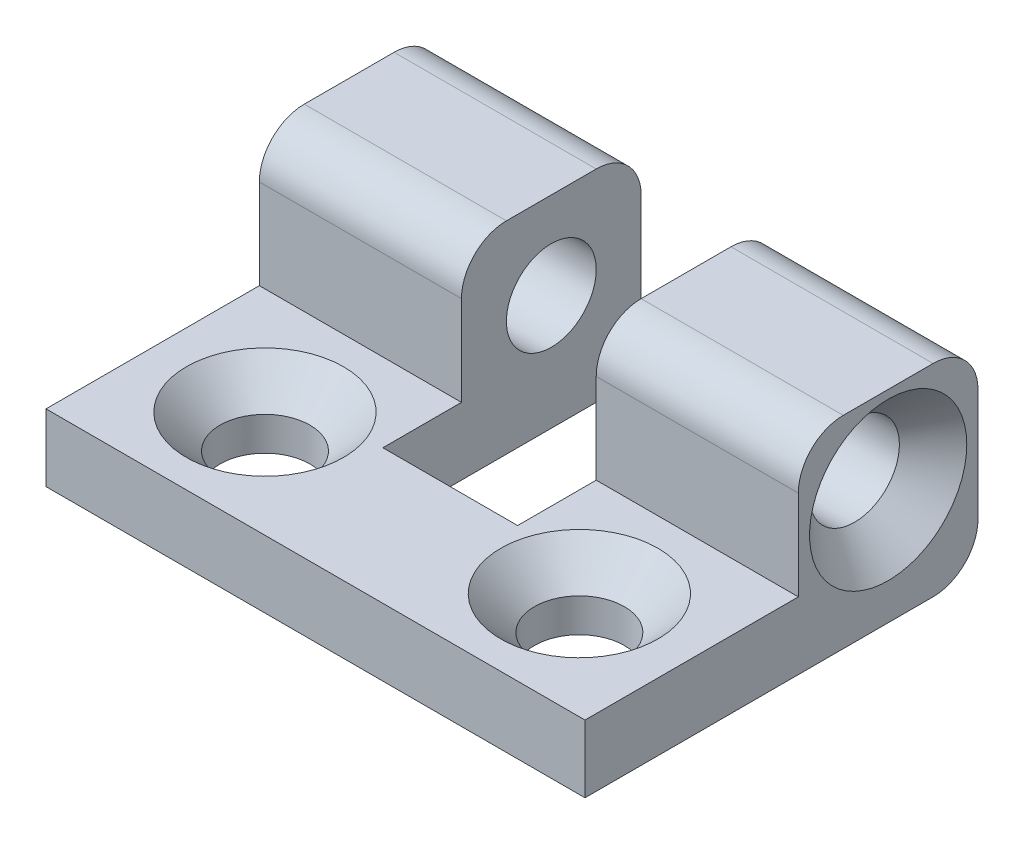
ISO-10303-21;
HEADER;
FILE_DESCRIPTION(('STEP AP214'),'2;1');
FILE_NAME('part.step','',(''),(''),'','','');
FILE_SCHEMA(('AUTOMOTIVE_DESIGN { 1 0 10303 214 1 1 1 1 }'));
ENDSEC;
DATA;
#1=APPLICATION_CONTEXT('core data for automotive mechanical design processes');
#2=APPLICATION_PROTOCOL_DEFINITION('international standard','automotive_design',2000,#1);
#3=PRODUCT_CONTEXT('',#1,'mechanical');
#4=PRODUCT('Part','Part','',(#3));
#5=PRODUCT_RELATED_PRODUCT_CATEGORY('part','',(#4));
#6=PRODUCT_DEFINITION_FORMATION('','',#4);
#7=PRODUCT_DEFINITION_CONTEXT('part definition',#1,'design');
#8=PRODUCT_DEFINITION('design','',#6,#7);
#9=PRODUCT_DEFINITION_SHAPE('','',#8);
#10=(LENGTH_UNIT() NAMED_UNIT(*) SI_UNIT(.MILLI.,.METRE.));
#11=(NAMED_UNIT(*) PLANE_ANGLE_UNIT() SI_UNIT($,.RADIAN.));
#12=(NAMED_UNIT(*) SI_UNIT($,.STERADIAN.) SOLID_ANGLE_UNIT());
#13=UNCERTAINTY_MEASURE_WITH_UNIT(LENGTH_MEASURE(1.E-05),#10,'distance_accuracy_value','');
#14=(GEOMETRIC_REPRESENTATION_CONTEXT(3) GLOBAL_UNCERTAINTY_ASSIGNED_CONTEXT((#13)) GLOBAL_UNIT_ASSIGNED_CONTEXT((#10,
#11,#12)) REPRESENTATION_CONTEXT('',''));
#15=CARTESIAN_POINT('',(0.,0.,0.));
#16=DIRECTION('',(0.,0.,1.));
#17=DIRECTION('',(1.,0.,0.));
#18=AXIS2_PLACEMENT_3D('',#15,#16,#17);
#19=CARTESIAN_POINT('',(24.,-1.72222222222222,8.24074074074074));
#20=DIRECTION('',(0.,1.,0.));
#21=DIRECTION('',(0.,0.,1.));
#22=AXIS2_PLACEMENT_3D('',#19,#20,#21);
#23=PLANE('',#22);
#24=CARTESIAN_POINT('',(19.,-1.72222222222222,3.49074074074074));
#25=DIRECTION('',(0.,1.,0.));
#26=DIRECTION('',(0.,0.,1.));
#27=AXIS2_PLACEMENT_3D('',#24,#25,#26);
#28=CIRCLE('',#27,2.);
#29=CARTESIAN_POINT('',(19.,-1.72222222222222,5.49074074074074));
#30=VERTEX_POINT('',#29);
#31=EDGE_CURVE('E279',#30,#30,#28,.F.);
#32=ORIENTED_EDGE('',*,*,#31,.F.);
#33=EDGE_LOOP('',(#32));
#34=FACE_BOUND('',#33,.T.);
#35=CARTESIAN_POINT('',(5.,-1.72222222222222,3.49074074074074));
#36=DIRECTION('',(0.,1.,0.));
#37=DIRECTION('',(0.,0.,1.));
#38=AXIS2_PLACEMENT_3D('',#35,#36,#37);
#39=CIRCLE('',#38,2.);
#40=CARTESIAN_POINT('',(5.,-1.72222222222222,5.49074074074074));
#41=VERTEX_POINT('',#40);
#42=EDGE_CURVE('E278',#41,#41,#39,.F.);
#43=ORIENTED_EDGE('',*,*,#42,.F.);
#44=EDGE_LOOP('',(#43));
#45=FACE_BOUND('',#44,.T.);
#46=DIRECTION('',(0.,0.,-1.));
#47=VECTOR('',#46,1.);
#48=CARTESIAN_POINT('',(9.00000000000001,-1.72222222222222,8.24074074074074));
#49=LINE('',#48,#47);
#50=CARTESIAN_POINT('',(9.,-1.72222222222222,2.24074074074074));
#51=VERTEX_POINT('',#50);
#52=CARTESIAN_POINT('',(9.,-1.72222222222222,-7.25925925925924));
#53=VERTEX_POINT('',#52);
#54=EDGE_CURVE('E325',#51,#53,#49,.T.);
#55=ORIENTED_EDGE('',*,*,#54,.F.);
#56=DIRECTION('',(-1.,0.,0.));
#57=VECTOR('',#56,1.);
#58=CARTESIAN_POINT('',(24.,-1.72222222222222,2.24074074074074));
#59=LINE('',#58,#57);
#60=CARTESIAN_POINT('',(15.,-1.72222222222222,2.24074074074074));
#61=VERTEX_POINT('',#60);
#62=EDGE_CURVE('E328',#61,#51,#59,.T.);
#63=ORIENTED_EDGE('',*,*,#62,.F.);
#64=DIRECTION('',(0.,0.,1.));
#65=VECTOR('',#64,1.);
#66=CARTESIAN_POINT('',(15.,-1.72222222222222,8.24074074074074));
#67=LINE('',#66,#65);
#68=CARTESIAN_POINT('',(15.,-1.72222222222222,-7.25925925925924));
#69=VERTEX_POINT('',#68);
#70=EDGE_CURVE('E211',#69,#61,#67,.T.);
#71=ORIENTED_EDGE('',*,*,#70,.F.);
#72=DIRECTION('',(-1.,0.,0.));
#73=VECTOR('',#72,1.);
#74=CARTESIAN_POINT('',(24.,-1.72222222222222,-7.25925925925924));
#75=LINE('',#74,#73);
#76=CARTESIAN_POINT('',(24.,-1.72222222222222,-7.25925925925924));
#77=VERTEX_POINT('',#76);
#78=EDGE_CURVE('E196',#77,#69,#75,.T.);
#79=ORIENTED_EDGE('',*,*,#78,.F.);
#80=DIRECTION('',(0.,0.,-1.));
#81=VECTOR('',#80,1.);
#82=CARTESIAN_POINT('',(24.,-1.72222222222222,8.24074074074074));
#83=LINE('',#82,#81);
#84=CARTESIAN_POINT('',(24.,-1.72222222222222,8.24074074074074));
#85=VERTEX_POINT('',#84);
#86=EDGE_CURVE('E101',#85,#77,#83,.T.);
#87=ORIENTED_EDGE('',*,*,#86,.F.);
#88=DIRECTION('',(-1.,0.,0.));
#89=VECTOR('',#88,1.);
#90=CARTESIAN_POINT('',(24.,-1.72222222222222,8.24074074074074));
#91=LINE('',#90,#89);
#92=CARTESIAN_POINT('',(0.,-1.72222222222222,8.24074074074074));
#93=VERTEX_POINT('',#92);
#94=EDGE_CURVE('E199',#85,#93,#91,.T.);
#95=ORIENTED_EDGE('',*,*,#94,.T.);
#96=DIRECTION('',(0.,0.,-1.));
#97=VECTOR('',#96,1.);
#98=CARTESIAN_POINT('',(0.,-1.72222222222222,8.24074074074074));
#99=LINE('',#98,#97);
#100=CARTESIAN_POINT('',(0.,-1.72222222222222,-7.25925925925924));
#101=VERTEX_POINT('',#100);
#102=EDGE_CURVE('E154',#93,#101,#99,.T.);
#103=ORIENTED_EDGE('',*,*,#102,.T.);
#104=EDGE_CURVE('E195',#53,#101,#75,.T.);
#105=ORIENTED_EDGE('',*,*,#104,.F.);
#106=EDGE_LOOP('',(#55,#63,#71,#79,#87,#95,#103,#105));
#107=FACE_BOUND('',#106,.T.);
#108=ADVANCED_FACE('F33',(#34,#45,#107),#23,.F.);
#109=CARTESIAN_POINT('',(24.,0.277777777777777,-7.25925925925926));
#110=DIRECTION('',(-1.,0.,0.));
#111=DIRECTION('',(0.,0.,1.));
#112=AXIS2_PLACEMENT_3D('',#109,#110,#111);
#113=CYLINDRICAL_SURFACE('',#112,2.);
#114=CARTESIAN_POINT('',(9.,0.277777777777777,-7.25925925925926));
#115=DIRECTION('',(1.,0.,0.));
#116=DIRECTION('',(0.,0.,-1.));
#117=AXIS2_PLACEMENT_3D('',#114,#115,#116);
#118=CIRCLE('',#117,2.);
#119=CARTESIAN_POINT('',(9.,0.27777777777779,-9.25925925925926));
#120=VERTEX_POINT('',#119);
#121=EDGE_CURVE('E322',#53,#120,#118,.T.);
#122=ORIENTED_EDGE('',*,*,#121,.F.);
#123=ORIENTED_EDGE('',*,*,#104,.T.);
#124=CARTESIAN_POINT('',(0.,0.277777777777777,-7.25925925925926));
#125=DIRECTION('',(1.,0.,0.));
#126=DIRECTION('',(0.,0.,-1.));
#127=AXIS2_PLACEMENT_3D('',#124,#125,#126);
#128=CIRCLE('',#127,2.);
#129=CARTESIAN_POINT('',(0.,0.277777777777792,-9.25925925925926));
#130=VERTEX_POINT('',#129);
#131=EDGE_CURVE('E158',#101,#130,#128,.T.);
#132=ORIENTED_EDGE('',*,*,#131,.T.);
#133=DIRECTION('',(-1.,0.,0.));
#134=VECTOR('',#133,1.);
#135=CARTESIAN_POINT('',(24.,0.277777777777792,-9.25925925925926));
#136=LINE('',#135,#134);
#137=EDGE_CURVE('E191',#120,#130,#136,.T.);
#138=ORIENTED_EDGE('',*,*,#137,.F.);
#139=EDGE_LOOP('',(#122,#123,#132,#138));
#140=FACE_BOUND('',#139,.T.);
#141=ADVANCED_FACE('F240',(#140),#113,.T.);
#142=CARTESIAN_POINT('',(15.,0.277777777777777,-7.25925925925926));
#143=DIRECTION('',(-1.,0.,0.));
#144=DIRECTION('',(0.,0.,1.));
#145=AXIS2_PLACEMENT_3D('',#142,#143,#144);
#146=CIRCLE('',#145,2.);
#147=CARTESIAN_POINT('',(15.,0.27777777777779,-9.25925925925926));
#148=VERTEX_POINT('',#147);
#149=EDGE_CURVE('E304',#148,#69,#146,.T.);
#150=ORIENTED_EDGE('',*,*,#149,.F.);
#151=CARTESIAN_POINT('',(24.,0.277777777777792,-9.25925925925926));
#152=VERTEX_POINT('',#151);
#153=EDGE_CURVE('E192',#152,#148,#136,.T.);
#154=ORIENTED_EDGE('',*,*,#153,.F.);
#155=CARTESIAN_POINT('',(24.,0.277777777777777,-7.25925925925926));
#156=DIRECTION('',(1.,0.,0.));
#157=DIRECTION('',(0.,0.,-1.));
#158=AXIS2_PLACEMENT_3D('',#155,#156,#157);
#159=CIRCLE('',#158,2.);
#160=EDGE_CURVE('E335',#77,#152,#159,.T.);
#161=ORIENTED_EDGE('',*,*,#160,.F.);
#162=ORIENTED_EDGE('',*,*,#78,.T.);
#163=EDGE_LOOP('',(#150,#154,#161,#162));
#164=FACE_BOUND('',#163,.T.);
#165=ADVANCED_FACE('F246',(#164),#113,.T.);
#166=CARTESIAN_POINT('',(24.,5.27777777777777,-9.25925925925926));
#167=DIRECTION('',(0.,0.,1.));
#168=DIRECTION('',(0.,-1.,0.));
#169=AXIS2_PLACEMENT_3D('',#166,#167,#168);
#170=PLANE('',#169);
#171=DIRECTION('',(0.,-1.,0.));
#172=VECTOR('',#171,1.);
#173=CARTESIAN_POINT('',(9.,25.2777777777778,-9.25925925925926));
#174=LINE('',#173,#172);
#175=CARTESIAN_POINT('',(9.,5.27777777777778,-9.25925925925926));
#176=VERTEX_POINT('',#175);
#177=EDGE_CURVE('E282',#176,#120,#174,.T.);
#178=ORIENTED_EDGE('',*,*,#177,.T.);
#179=ORIENTED_EDGE('',*,*,#137,.T.);
#180=DIRECTION('',(0.,1.,0.));
#181=VECTOR('',#180,1.);
#182=CARTESIAN_POINT('',(0.,5.27777777777777,-9.25925925925926));
#183=LINE('',#182,#181);
#184=CARTESIAN_POINT('',(0.,5.27777777777777,-9.25925925925926));
#185=VERTEX_POINT('',#184);
#186=EDGE_CURVE('E161',#130,#185,#183,.T.);
#187=ORIENTED_EDGE('',*,*,#186,.T.);
#188=DIRECTION('',(-1.,0.,0.));
#189=VECTOR('',#188,1.);
#190=CARTESIAN_POINT('',(24.,5.27777777777777,-9.25925925925926));
#191=LINE('',#190,#189);
#192=EDGE_CURVE('E187',#176,#185,#191,.T.);
#193=ORIENTED_EDGE('',*,*,#192,.F.);
#194=EDGE_LOOP('',(#178,#179,#187,#193));
#195=FACE_BOUND('',#194,.T.);
#196=ADVANCED_FACE('F395',(#195),#170,.F.);
#197=DIRECTION('',(0.,-1.,0.));
#198=VECTOR('',#197,1.);
#199=CARTESIAN_POINT('',(15.,25.2777777777778,-9.25925925925926));
#200=LINE('',#199,#198);
#201=CARTESIAN_POINT('',(15.,5.27777777777778,-9.25925925925926));
#202=VERTEX_POINT('',#201);
#203=EDGE_CURVE('E287',#202,#148,#200,.T.);
#204=ORIENTED_EDGE('',*,*,#203,.F.);
#205=CARTESIAN_POINT('',(24.,5.27777777777777,-9.25925925925926));
#206=VERTEX_POINT('',#205);
#207=EDGE_CURVE('E188',#206,#202,#191,.T.);
#208=ORIENTED_EDGE('',*,*,#207,.F.);
#209=DIRECTION('',(0.,1.,0.));
#210=VECTOR('',#209,1.);
#211=CARTESIAN_POINT('',(24.,5.27777777777777,-9.25925925925926));
#212=LINE('',#211,#210);
#213=EDGE_CURVE('E337',#152,#206,#212,.T.);
#214=ORIENTED_EDGE('',*,*,#213,.F.);
#215=ORIENTED_EDGE('',*,*,#153,.T.);
#216=EDGE_LOOP('',(#204,#208,#214,#215));
#217=FACE_BOUND('',#216,.T.);
#218=ADVANCED_FACE('F431',(#217),#170,.F.);
#219=CARTESIAN_POINT('',(24.,5.27777777777778,-7.25925925925926));
#220=DIRECTION('',(-1.,0.,0.));
#221=DIRECTION('',(0.,0.,1.));
#222=AXIS2_PLACEMENT_3D('',#219,#220,#221);
#223=CYLINDRICAL_SURFACE('',#222,2.);
#224=CARTESIAN_POINT('',(9.,5.27777777777778,-7.25925925925926));
#225=DIRECTION('',(1.,0.,0.));
#226=DIRECTION('',(0.,0.,-1.));
#227=AXIS2_PLACEMENT_3D('',#224,#225,#226);
#228=CIRCLE('',#227,2.);
#229=CARTESIAN_POINT('',(9.,7.27777777777778,-7.25925925925924));
#230=VERTEX_POINT('',#229);
#231=EDGE_CURVE('E319',#176,#230,#228,.T.);
#232=ORIENTED_EDGE('',*,*,#231,.F.);
#233=ORIENTED_EDGE('',*,*,#192,.T.);
#234=CARTESIAN_POINT('',(0.,5.27777777777778,-7.25925925925926));
#235=DIRECTION('',(1.,0.,0.));
#236=DIRECTION('',(0.,0.,-1.));
#237=AXIS2_PLACEMENT_3D('',#234,#235,#236);
#238=CIRCLE('',#237,2.);
#239=CARTESIAN_POINT('',(0.,7.27777777777778,-7.25925925925924));
#240=VERTEX_POINT('',#239);
#241=EDGE_CURVE('E164',#185,#240,#238,.T.);
#242=ORIENTED_EDGE('',*,*,#241,.T.);
#243=DIRECTION('',(-1.,0.,0.));
#244=VECTOR('',#243,1.);
#245=CARTESIAN_POINT('',(24.,7.27777777777778,-7.25925925925924));
#246=LINE('',#245,#244);
#247=EDGE_CURVE('E183',#230,#240,#246,.T.);
#248=ORIENTED_EDGE('',*,*,#247,.F.);
#249=EDGE_LOOP('',(#232,#233,#242,#248));
#250=FACE_BOUND('',#249,.T.);
#251=ADVANCED_FACE('F398',(#250),#223,.T.);
#252=CARTESIAN_POINT('',(15.,5.27777777777778,-7.25925925925926));
#253=DIRECTION('',(-1.,0.,0.));
#254=DIRECTION('',(0.,0.,1.));
#255=AXIS2_PLACEMENT_3D('',#252,#253,#254);
#256=CIRCLE('',#255,2.);
#257=CARTESIAN_POINT('',(15.,7.27777777777778,-7.25925925925924));
#258=VERTEX_POINT('',#257);
#259=EDGE_CURVE('E301',#258,#202,#256,.T.);
#260=ORIENTED_EDGE('',*,*,#259,.F.);
#261=CARTESIAN_POINT('',(24.,7.27777777777778,-7.25925925925924));
#262=VERTEX_POINT('',#261);
#263=EDGE_CURVE('E184',#262,#258,#246,.T.);
#264=ORIENTED_EDGE('',*,*,#263,.F.);
#265=CARTESIAN_POINT('',(24.,5.27777777777778,-7.25925925925926));
#266=DIRECTION('',(1.,0.,0.));
#267=DIRECTION('',(0.,0.,-1.));
#268=AXIS2_PLACEMENT_3D('',#265,#266,#267);
#269=CIRCLE('',#268,2.);
#270=EDGE_CURVE('E339',#206,#262,#269,.T.);
#271=ORIENTED_EDGE('',*,*,#270,.F.);
#272=ORIENTED_EDGE('',*,*,#207,.T.);
#273=EDGE_LOOP('',(#260,#264,#271,#272));
#274=FACE_BOUND('',#273,.T.);
#275=ADVANCED_FACE('F346',(#274),#223,.T.);
#276=CARTESIAN_POINT('',(24.,7.27777777777778,-7.25925925925924));
#277=DIRECTION('',(0.,-1.,0.));
#278=DIRECTION('',(0.,0.,-1.));
#279=AXIS2_PLACEMENT_3D('',#276,#277,#278);
#280=PLANE('',#279);
#281=DIRECTION('',(0.,0.,1.));
#282=VECTOR('',#281,1.);
#283=CARTESIAN_POINT('',(9.,7.27777777777778,-7.25925925925924));
#284=LINE('',#283,#282);
#285=CARTESIAN_POINT('',(9.,7.27777777777778,-3.25925925925927));
#286=VERTEX_POINT('',#285);
#287=EDGE_CURVE('E316',#230,#286,#284,.T.);
#288=ORIENTED_EDGE('',*,*,#287,.F.);
#289=ORIENTED_EDGE('',*,*,#247,.T.);
#290=DIRECTION('',(0.,0.,1.));
#291=VECTOR('',#290,1.);
#292=CARTESIAN_POINT('',(0.,7.27777777777778,-7.25925925925924));
#293=LINE('',#292,#291);
#294=CARTESIAN_POINT('',(0.,7.27777777777778,-3.25925925925927));
#295=VERTEX_POINT('',#294);
#296=EDGE_CURVE('E167',#240,#295,#293,.T.);
#297=ORIENTED_EDGE('',*,*,#296,.T.);
#298=DIRECTION('',(-1.,0.,0.));
#299=VECTOR('',#298,1.);
#300=CARTESIAN_POINT('',(24.,7.27777777777778,-3.25925925925927));
#301=LINE('',#300,#299);
#302=EDGE_CURVE('E140',#286,#295,#301,.T.);
#303=ORIENTED_EDGE('',*,*,#302,.F.);
#304=EDGE_LOOP('',(#288,#289,#297,#303));
#305=FACE_BOUND('',#304,.T.);
#306=ADVANCED_FACE('F400',(#305),#280,.F.);
#307=DIRECTION('',(0.,0.,-1.));
#308=VECTOR('',#307,1.);
#309=CARTESIAN_POINT('',(15.,7.27777777777778,-7.25925925925924));
#310=LINE('',#309,#308);
#311=CARTESIAN_POINT('',(15.,7.27777777777778,-3.25925925925927));
#312=VERTEX_POINT('',#311);
#313=EDGE_CURVE('E298',#312,#258,#310,.T.);
#314=ORIENTED_EDGE('',*,*,#313,.F.);
#315=CARTESIAN_POINT('',(24.,7.27777777777778,-3.25925925925927));
#316=VERTEX_POINT('',#315);
#317=EDGE_CURVE('E181',#316,#312,#301,.T.);
#318=ORIENTED_EDGE('',*,*,#317,.F.);
#319=DIRECTION('',(0.,0.,1.));
#320=VECTOR('',#319,1.);
#321=CARTESIAN_POINT('',(24.,7.27777777777778,-7.25925925925924));
#322=LINE('',#321,#320);
#323=EDGE_CURVE('E126',#262,#316,#322,.T.);
#324=ORIENTED_EDGE('',*,*,#323,.F.);
#325=ORIENTED_EDGE('',*,*,#263,.T.);
#326=EDGE_LOOP('',(#314,#318,#324,#325));
#327=FACE_BOUND('',#326,.T.);
#328=ADVANCED_FACE('F350',(#327),#280,.F.);
#329=CARTESIAN_POINT('',(24.,5.27777777777778,-3.25925925925925));
#330=DIRECTION('',(-1.,0.,0.));
#331=DIRECTION('',(0.,0.,1.));
#332=AXIS2_PLACEMENT_3D('',#329,#330,#331);
#333=CYLINDRICAL_SURFACE('',#332,2.);
#334=CARTESIAN_POINT('',(9.,5.27777777777778,-3.25925925925925));
#335=DIRECTION('',(1.,0.,0.));
#336=DIRECTION('',(0.,0.,-1.));
#337=AXIS2_PLACEMENT_3D('',#334,#335,#336);
#338=CIRCLE('',#337,2.);
#339=CARTESIAN_POINT('',(9.,5.27777777777776,-1.25925925925925));
#340=VERTEX_POINT('',#339);
#341=EDGE_CURVE('E313',#286,#340,#338,.T.);
#342=ORIENTED_EDGE('',*,*,#341,.F.);
#343=ORIENTED_EDGE('',*,*,#302,.T.);
#344=CARTESIAN_POINT('',(0.,5.27777777777778,-3.25925925925925));
#345=DIRECTION('',(1.,0.,0.));
#346=DIRECTION('',(0.,0.,-1.));
#347=AXIS2_PLACEMENT_3D('',#344,#345,#346);
#348=CIRCLE('',#347,2.);
#349=CARTESIAN_POINT('',(0.,5.27777777777776,-1.25925925925925));
#350=VERTEX_POINT('',#349);
#351=EDGE_CURVE('E170',#295,#350,#348,.T.);
#352=ORIENTED_EDGE('',*,*,#351,.T.);
#353=DIRECTION('',(-1.,0.,0.));
#354=VECTOR('',#353,1.);
#355=CARTESIAN_POINT('',(24.,5.27777777777776,-1.25925925925925));
#356=LINE('',#355,#354);
#357=EDGE_CURVE('E141',#340,#350,#356,.T.);
#358=ORIENTED_EDGE('',*,*,#357,.F.);
#359=EDGE_LOOP('',(#342,#343,#352,#358));
#360=FACE_BOUND('',#359,.T.);
#361=ADVANCED_FACE('F407',(#360),#333,.T.);
#362=CARTESIAN_POINT('',(15.,5.27777777777778,-3.25925925925925));
#363=DIRECTION('',(-1.,0.,0.));
#364=DIRECTION('',(0.,0.,1.));
#365=AXIS2_PLACEMENT_3D('',#362,#363,#364);
#366=CIRCLE('',#365,2.);
#367=CARTESIAN_POINT('',(15.,5.27777777777776,-1.25925925925925));
#368=VERTEX_POINT('',#367);
#369=EDGE_CURVE('E137',#368,#312,#366,.T.);
#370=ORIENTED_EDGE('',*,*,#369,.F.);
#371=CARTESIAN_POINT('',(24.,5.27777777777776,-1.25925925925925));
#372=VERTEX_POINT('',#371);
#373=EDGE_CURVE('E133',#372,#368,#356,.T.);
#374=ORIENTED_EDGE('',*,*,#373,.F.);
#375=CARTESIAN_POINT('',(24.,5.27777777777778,-3.25925925925925));
#376=DIRECTION('',(1.,0.,0.));
#377=DIRECTION('',(0.,0.,-1.));
#378=AXIS2_PLACEMENT_3D('',#375,#376,#377);
#379=CIRCLE('',#378,2.);
#380=EDGE_CURVE('E119',#316,#372,#379,.T.);
#381=ORIENTED_EDGE('',*,*,#380,.F.);
#382=ORIENTED_EDGE('',*,*,#317,.T.);
#383=EDGE_LOOP('',(#370,#374,#381,#382));
#384=FACE_BOUND('',#383,.T.);
#385=ADVANCED_FACE('F134',(#384),#333,.T.);
#386=CARTESIAN_POINT('',(24.,1.27777777777778,-1.25925925925925));
#387=DIRECTION('',(0.,0.,-1.));
#388=DIRECTION('',(-1.,0.,0.));
#389=AXIS2_PLACEMENT_3D('',#386,#387,#388);
#390=PLANE('',#389);
#391=DIRECTION('',(0.,-1.,0.));
#392=VECTOR('',#391,1.);
#393=CARTESIAN_POINT('',(9.,1.27777777777778,-1.25925925925925));
#394=LINE('',#393,#392);
#395=CARTESIAN_POINT('',(9.,1.27777777777778,-1.25925925925926));
#396=VERTEX_POINT('',#395);
#397=EDGE_CURVE('E310',#340,#396,#394,.T.);
#398=ORIENTED_EDGE('',*,*,#397,.F.);
#399=ORIENTED_EDGE('',*,*,#357,.T.);
#400=DIRECTION('',(0.,-1.,0.));
#401=VECTOR('',#400,1.);
#402=CARTESIAN_POINT('',(0.,1.27777777777778,-1.25925925925925));
#403=LINE('',#402,#401);
#404=CARTESIAN_POINT('',(0.,1.27777777777778,-1.25925925925925));
#405=VERTEX_POINT('',#404);
#406=EDGE_CURVE('E173',#350,#405,#403,.T.);
#407=ORIENTED_EDGE('',*,*,#406,.T.);
#408=DIRECTION('',(-1.,0.,0.));
#409=VECTOR('',#408,1.);
#410=CARTESIAN_POINT('',(24.,1.27777777777778,-1.25925925925925));
#411=LINE('',#410,#409);
#412=EDGE_CURVE('E179',#396,#405,#411,.T.);
#413=ORIENTED_EDGE('',*,*,#412,.F.);
#414=EDGE_LOOP('',(#398,#399,#407,#413));
#415=FACE_BOUND('',#414,.T.);
#416=ADVANCED_FACE('F410',(#415),#390,.F.);
#417=DIRECTION('',(0.,1.,0.));
#418=VECTOR('',#417,1.);
#419=CARTESIAN_POINT('',(15.,1.27777777777778,-1.25925925925925));
#420=LINE('',#419,#418);
#421=CARTESIAN_POINT('',(15.,1.27777777777778,-1.25925925925926));
#422=VERTEX_POINT('',#421);
#423=EDGE_CURVE('E294',#422,#368,#420,.T.);
#424=ORIENTED_EDGE('',*,*,#423,.F.);
#425=CARTESIAN_POINT('',(24.,1.27777777777778,-1.25925925925925));
#426=VERTEX_POINT('',#425);
#427=EDGE_CURVE('E145',#426,#422,#411,.T.);
#428=ORIENTED_EDGE('',*,*,#427,.F.);
#429=DIRECTION('',(0.,-1.,0.));
#430=VECTOR('',#429,1.);
#431=CARTESIAN_POINT('',(24.,1.27777777777778,-1.25925925925925));
#432=LINE('',#431,#430);
#433=EDGE_CURVE('E123',#372,#426,#432,.T.);
#434=ORIENTED_EDGE('',*,*,#433,.F.);
#435=ORIENTED_EDGE('',*,*,#373,.T.);
#436=EDGE_LOOP('',(#424,#428,#434,#435));
#437=FACE_BOUND('',#436,.T.);
#438=ADVANCED_FACE('F143',(#437),#390,.F.);
#439=CARTESIAN_POINT('',(24.,1.27777777777778,8.24074074074074));
#440=DIRECTION('',(0.,-1.,0.));
#441=DIRECTION('',(0.,0.,-1.));
#442=AXIS2_PLACEMENT_3D('',#439,#440,#441);
#443=PLANE('',#442);
#444=CARTESIAN_POINT('',(5.,1.27777777777778,3.49074074074074));
#445=DIRECTION('',(0.,-1.,0.));
#446=DIRECTION('',(0.,0.,-1.));
#447=AXIS2_PLACEMENT_3D('',#444,#445,#446);
#448=CIRCLE('',#447,3.50000000000001);
#449=CARTESIAN_POINT('',(5.,1.27777777777778,-0.00925925925926397));
#450=VERTEX_POINT('',#449);
#451=EDGE_CURVE('E219',#450,#450,#448,.T.);
#452=ORIENTED_EDGE('',*,*,#451,.T.);
#453=EDGE_LOOP('',(#452));
#454=FACE_BOUND('',#453,.T.);
#455=CARTESIAN_POINT('',(19.,1.27777777777778,3.49074074074074));
#456=DIRECTION('',(0.,-1.,0.));
#457=DIRECTION('',(0.,0.,-1.));
#458=AXIS2_PLACEMENT_3D('',#455,#456,#457);
#459=CIRCLE('',#458,3.50000000000001);
#460=CARTESIAN_POINT('',(19.,1.27777777777778,-0.00925925925926831));
#461=VERTEX_POINT('',#460);
#462=EDGE_CURVE('E216',#461,#461,#459,.T.);
#463=ORIENTED_EDGE('',*,*,#462,.T.);
#464=EDGE_LOOP('',(#463));
#465=FACE_BOUND('',#464,.T.);
#466=DIRECTION('',(0.,0.,1.));
#467=VECTOR('',#466,1.);
#468=CARTESIAN_POINT('',(9.00000000000001,1.27777777777778,8.24074074074074));
#469=LINE('',#468,#467);
#470=CARTESIAN_POINT('',(9.,1.27777777777778,2.24074074074074));
#471=VERTEX_POINT('',#470);
#472=EDGE_CURVE('E210',#396,#471,#469,.T.);
#473=ORIENTED_EDGE('',*,*,#472,.F.);
#474=ORIENTED_EDGE('',*,*,#412,.T.);
#475=DIRECTION('',(0.,0.,1.));
#476=VECTOR('',#475,1.);
#477=CARTESIAN_POINT('',(0.,1.27777777777778,8.24074074074074));
#478=LINE('',#477,#476);
#479=CARTESIAN_POINT('',(0.,1.27777777777778,8.24074074074074));
#480=VERTEX_POINT('',#479);
#481=EDGE_CURVE('E92',#405,#480,#478,.T.);
#482=ORIENTED_EDGE('',*,*,#481,.T.);
#483=DIRECTION('',(-1.,0.,0.));
#484=VECTOR('',#483,1.);
#485=CARTESIAN_POINT('',(24.,1.27777777777778,8.24074074074074));
#486=LINE('',#485,#484);
#487=CARTESIAN_POINT('',(24.,1.27777777777778,8.24074074074074));
#488=VERTEX_POINT('',#487);
#489=EDGE_CURVE('E147',#488,#480,#486,.T.);
#490=ORIENTED_EDGE('',*,*,#489,.F.);
#491=DIRECTION('',(0.,0.,1.));
#492=VECTOR('',#491,1.);
#493=CARTESIAN_POINT('',(24.,1.27777777777778,8.24074074074074));
#494=LINE('',#493,#492);
#495=EDGE_CURVE('E57',#426,#488,#494,.T.);
#496=ORIENTED_EDGE('',*,*,#495,.F.);
#497=ORIENTED_EDGE('',*,*,#427,.T.);
#498=DIRECTION('',(0.,0.,-1.));
#499=VECTOR('',#498,1.);
#500=CARTESIAN_POINT('',(15.,1.27777777777778,8.24074074074074));
#501=LINE('',#500,#499);
#502=CARTESIAN_POINT('',(15.,1.27777777777778,2.24074074074074));
#503=VERTEX_POINT('',#502);
#504=EDGE_CURVE('E205',#503,#422,#501,.T.);
#505=ORIENTED_EDGE('',*,*,#504,.F.);
#506=DIRECTION('',(1.,0.,0.));
#507=VECTOR('',#506,1.);
#508=CARTESIAN_POINT('',(24.,1.27777777777778,2.24074074074074));
#509=LINE('',#508,#507);
#510=EDGE_CURVE('E201',#471,#503,#509,.T.);
#511=ORIENTED_EDGE('',*,*,#510,.F.);
#512=EDGE_LOOP('',(#473,#474,#482,#490,#496,#497,#505,#511));
#513=FACE_BOUND('',#512,.T.);
#514=ADVANCED_FACE('F414',(#454,#465,#513),#443,.F.);
#515=CARTESIAN_POINT('',(24.,3.40125316075757,-5.25925925925926));
#516=DIRECTION('',(-1.,0.,0.));
#517=DIRECTION('',(0.,0.,1.));
#518=AXIS2_PLACEMENT_3D('',#515,#516,#517);
#519=CYLINDRICAL_SURFACE('',#518,2.);
#520=CARTESIAN_POINT('',(0.,3.40125316075757,-5.25925925925926));
#521=DIRECTION('',(1.,0.,0.));
#522=DIRECTION('',(0.,0.,-1.));
#523=AXIS2_PLACEMENT_3D('',#520,#521,#522);
#524=CIRCLE('',#523,2.);
#525=CARTESIAN_POINT('',(0.,3.40125316075757,-7.25925925925926));
#526=VERTEX_POINT('',#525);
#527=EDGE_CURVE('E155',#526,#526,#524,.T.);
#528=ORIENTED_EDGE('',*,*,#527,.F.);
#529=EDGE_LOOP('',(#528));
#530=FACE_BOUND('',#529,.T.);
#531=CARTESIAN_POINT('',(9.,3.40125316075757,-5.25925925925926));
#532=DIRECTION('',(1.,0.,0.));
#533=DIRECTION('',(0.,0.,-1.));
#534=AXIS2_PLACEMENT_3D('',#531,#532,#533);
#535=CIRCLE('',#534,2.);
#536=CARTESIAN_POINT('',(9.,3.40125316075757,-7.25925925925926));
#537=VERTEX_POINT('',#536);
#538=EDGE_CURVE('E207',#537,#537,#535,.T.);
#539=ORIENTED_EDGE('',*,*,#538,.T.);
#540=EDGE_LOOP('',(#539));
#541=FACE_BOUND('',#540,.T.);
#542=ADVANCED_FACE('F447',(#530,#541),#519,.F.);
#543=CARTESIAN_POINT('',(22.5,3.40125316075757,-5.25925925925926));
#544=DIRECTION('',(1.,0.,0.));
#545=DIRECTION('',(0.,0.,-1.));
#546=AXIS2_PLACEMENT_3D('',#543,#544,#545);
#547=CIRCLE('',#546,2.);
#548=CARTESIAN_POINT('',(22.5,3.40125316075757,-7.25925925925926));
#549=VERTEX_POINT('',#548);
#550=EDGE_CURVE('E41',#549,#549,#547,.T.);
#551=ORIENTED_EDGE('',*,*,#550,.T.);
#552=EDGE_LOOP('',(#551));
#553=FACE_BOUND('',#552,.T.);
#554=CARTESIAN_POINT('',(15.,3.40125316075757,-5.25925925925926));
#555=DIRECTION('',(-1.,0.,0.));
#556=DIRECTION('',(0.,0.,1.));
#557=AXIS2_PLACEMENT_3D('',#554,#555,#556);
#558=CIRCLE('',#557,2.);
#559=CARTESIAN_POINT('',(15.,3.40125316075757,-3.25925925925926));
#560=VERTEX_POINT('',#559);
#561=EDGE_CURVE('E202',#560,#560,#558,.T.);
#562=ORIENTED_EDGE('',*,*,#561,.T.);
#563=EDGE_LOOP('',(#562));
#564=FACE_BOUND('',#563,.T.);
#565=ADVANCED_FACE('F227',(#553,#564),#519,.F.);
#566=CARTESIAN_POINT('',(24.,0.277777777777777,-7.25925925925926));
#567=DIRECTION('',(1.,0.,0.));
#568=DIRECTION('',(0.,0.,-1.));
#569=AXIS2_PLACEMENT_3D('',#566,#567,#568);
#570=PLANE('',#569);
#571=CARTESIAN_POINT('',(24.,3.40125316075757,-5.25925925925926));
#572=DIRECTION('',(1.,0.,0.));
#573=DIRECTION('',(0.,0.,-1.));
#574=AXIS2_PLACEMENT_3D('',#571,#572,#573);
#575=CIRCLE('',#574,3.50000000000001);
#576=CARTESIAN_POINT('',(24.,3.40125316075757,-8.75925925925927));
#577=VERTEX_POINT('',#576);
#578=EDGE_CURVE('E11',#577,#577,#575,.F.);
#579=ORIENTED_EDGE('',*,*,#578,.T.);
#580=EDGE_LOOP('',(#579));
#581=FACE_BOUND('',#580,.T.);
#582=DIRECTION('',(0.,-1.,0.));
#583=VECTOR('',#582,1.);
#584=CARTESIAN_POINT('',(24.,1.27777777777778,8.24074074074074));
#585=LINE('',#584,#583);
#586=EDGE_CURVE('E177',#488,#85,#585,.T.);
#587=ORIENTED_EDGE('',*,*,#586,.T.);
#588=ORIENTED_EDGE('',*,*,#86,.T.);
#589=ORIENTED_EDGE('',*,*,#160,.T.);
#590=ORIENTED_EDGE('',*,*,#213,.T.);
#591=ORIENTED_EDGE('',*,*,#270,.T.);
#592=ORIENTED_EDGE('',*,*,#323,.T.);
#593=ORIENTED_EDGE('',*,*,#380,.T.);
#594=ORIENTED_EDGE('',*,*,#433,.T.);
#595=ORIENTED_EDGE('',*,*,#495,.T.);
#596=EDGE_LOOP('',(#587,#588,#589,#590,#591,#592,#593,#594,#595));
#597=FACE_BOUND('',#596,.T.);
#598=ADVANCED_FACE('F121',(#581,#597),#570,.T.);
#599=CARTESIAN_POINT('',(0.,0.277777777777777,-7.25925925925926));
#600=DIRECTION('',(1.,0.,0.));
#601=DIRECTION('',(0.,0.,-1.));
#602=AXIS2_PLACEMENT_3D('',#599,#600,#601);
#603=PLANE('',#602);
#604=DIRECTION('',(0.,-1.,0.));
#605=VECTOR('',#604,1.);
#606=CARTESIAN_POINT('',(0.,1.27777777777778,8.24074074074074));
#607=LINE('',#606,#605);
#608=EDGE_CURVE('E151',#480,#93,#607,.T.);
#609=ORIENTED_EDGE('',*,*,#608,.F.);
#610=ORIENTED_EDGE('',*,*,#481,.F.);
#611=ORIENTED_EDGE('',*,*,#406,.F.);
#612=ORIENTED_EDGE('',*,*,#351,.F.);
#613=ORIENTED_EDGE('',*,*,#296,.F.);
#614=ORIENTED_EDGE('',*,*,#241,.F.);
#615=ORIENTED_EDGE('',*,*,#186,.F.);
#616=ORIENTED_EDGE('',*,*,#131,.F.);
#617=ORIENTED_EDGE('',*,*,#102,.F.);
#618=EDGE_LOOP('',(#609,#610,#611,#612,#613,#614,#615,#616,#617));
#619=FACE_BOUND('',#618,.T.);
#620=ORIENTED_EDGE('',*,*,#527,.T.);
#621=EDGE_LOOP('',(#620));
#622=FACE_BOUND('',#621,.T.);
#623=ADVANCED_FACE('F257',(#619,#622),#603,.F.);
#624=CARTESIAN_POINT('',(24.,1.27777777777778,8.24074074074074));
#625=DIRECTION('',(0.,0.,-1.));
#626=DIRECTION('',(-1.,0.,0.));
#627=AXIS2_PLACEMENT_3D('',#624,#625,#626);
#628=PLANE('',#627);
#629=ORIENTED_EDGE('',*,*,#608,.T.);
#630=ORIENTED_EDGE('',*,*,#94,.F.);
#631=ORIENTED_EDGE('',*,*,#586,.F.);
#632=ORIENTED_EDGE('',*,*,#489,.T.);
#633=EDGE_LOOP('',(#629,#630,#631,#632));
#634=FACE_BOUND('',#633,.T.);
#635=ADVANCED_FACE('F253',(#634),#628,.F.);
#636=CARTESIAN_POINT('',(9.,25.2777777777778,2.24074074074074));
#637=DIRECTION('',(0.,0.,-1.));
#638=DIRECTION('',(-1.,0.,0.));
#639=AXIS2_PLACEMENT_3D('',#636,#637,#638);
#640=PLANE('',#639);
#641=ORIENTED_EDGE('',*,*,#62,.T.);
#642=DIRECTION('',(0.,-1.,0.));
#643=VECTOR('',#642,1.);
#644=CARTESIAN_POINT('',(9.,25.2777777777778,2.24074074074074));
#645=LINE('',#644,#643);
#646=EDGE_CURVE('E206',#471,#51,#645,.T.);
#647=ORIENTED_EDGE('',*,*,#646,.F.);
#648=ORIENTED_EDGE('',*,*,#510,.T.);
#649=DIRECTION('',(0.,-1.,0.));
#650=VECTOR('',#649,1.);
#651=CARTESIAN_POINT('',(15.,25.2777777777778,2.24074074074074));
#652=LINE('',#651,#650);
#653=EDGE_CURVE('E48',#503,#61,#652,.T.);
#654=ORIENTED_EDGE('',*,*,#653,.T.);
#655=EDGE_LOOP('',(#641,#647,#648,#654));
#656=FACE_BOUND('',#655,.T.);
#657=ADVANCED_FACE('F256',(#656),#640,.T.);
#658=CARTESIAN_POINT('',(9.,25.2777777777778,-9.25925925925926));
#659=DIRECTION('',(1.,0.,0.));
#660=DIRECTION('',(0.,0.,-1.));
#661=AXIS2_PLACEMENT_3D('',#658,#659,#660);
#662=PLANE('',#661);
#663=ORIENTED_EDGE('',*,*,#538,.F.);
#664=EDGE_LOOP('',(#663));
#665=FACE_BOUND('',#664,.T.);
#666=ORIENTED_EDGE('',*,*,#54,.T.);
#667=ORIENTED_EDGE('',*,*,#121,.T.);
#668=ORIENTED_EDGE('',*,*,#177,.F.);
#669=ORIENTED_EDGE('',*,*,#231,.T.);
#670=ORIENTED_EDGE('',*,*,#287,.T.);
#671=ORIENTED_EDGE('',*,*,#341,.T.);
#672=ORIENTED_EDGE('',*,*,#397,.T.);
#673=ORIENTED_EDGE('',*,*,#472,.T.);
#674=ORIENTED_EDGE('',*,*,#646,.T.);
#675=EDGE_LOOP('',(#666,#667,#668,#669,#670,#671,#672,#673,#674));
#676=FACE_BOUND('',#675,.T.);
#677=ADVANCED_FACE('F380',(#665,#676),#662,.T.);
#678=CARTESIAN_POINT('',(15.,25.2777777777778,-9.25925925925926));
#679=DIRECTION('',(-1.,0.,0.));
#680=DIRECTION('',(0.,0.,1.));
#681=AXIS2_PLACEMENT_3D('',#678,#679,#680);
#682=PLANE('',#681);
#683=ORIENTED_EDGE('',*,*,#561,.F.);
#684=EDGE_LOOP('',(#683));
#685=FACE_BOUND('',#684,.T.);
#686=ORIENTED_EDGE('',*,*,#70,.T.);
#687=ORIENTED_EDGE('',*,*,#653,.F.);
#688=ORIENTED_EDGE('',*,*,#504,.T.);
#689=ORIENTED_EDGE('',*,*,#423,.T.);
#690=ORIENTED_EDGE('',*,*,#369,.T.);
#691=ORIENTED_EDGE('',*,*,#313,.T.);
#692=ORIENTED_EDGE('',*,*,#259,.T.);
#693=ORIENTED_EDGE('',*,*,#203,.T.);
#694=ORIENTED_EDGE('',*,*,#149,.T.);
#695=EDGE_LOOP('',(#686,#687,#688,#689,#690,#691,#692,#693,#694));
#696=FACE_BOUND('',#695,.T.);
#697=ADVANCED_FACE('F274',(#685,#696),#682,.T.);
#698=CARTESIAN_POINT('',(5.,25.2777777777778,3.49074074074074));
#699=DIRECTION('',(0.,-1.,0.));
#700=DIRECTION('',(0.,0.,-1.));
#701=AXIS2_PLACEMENT_3D('',#698,#699,#700);
#702=CYLINDRICAL_SURFACE('',#701,2.);
#703=CARTESIAN_POINT('',(5.,-0.222222222222224,3.49074074074074));
#704=DIRECTION('',(0.,-1.,0.));
#705=DIRECTION('',(0.,0.,-1.));
#706=AXIS2_PLACEMENT_3D('',#703,#704,#705);
#707=CIRCLE('',#706,2.);
#708=CARTESIAN_POINT('',(5.,-0.222222222222224,1.49074074074074));
#709=VERTEX_POINT('',#708);
#710=EDGE_CURVE('E213',#709,#709,#707,.F.);
#711=ORIENTED_EDGE('',*,*,#710,.T.);
#712=EDGE_LOOP('',(#711));
#713=FACE_BOUND('',#712,.T.);
#714=ORIENTED_EDGE('',*,*,#42,.T.);
#715=EDGE_LOOP('',(#714));
#716=FACE_BOUND('',#715,.T.);
#717=ADVANCED_FACE('F265',(#713,#716),#702,.F.);
#718=CARTESIAN_POINT('',(19.,25.2777777777778,3.49074074074074));
#719=DIRECTION('',(0.,-1.,0.));
#720=DIRECTION('',(0.,0.,-1.));
#721=AXIS2_PLACEMENT_3D('',#718,#719,#720);
#722=CYLINDRICAL_SURFACE('',#721,2.);
#723=CARTESIAN_POINT('',(19.,-0.222222222222224,3.49074074074074));
#724=DIRECTION('',(0.,-1.,0.));
#725=DIRECTION('',(0.,0.,-1.));
#726=AXIS2_PLACEMENT_3D('',#723,#724,#725);
#727=CIRCLE('',#726,2.);
#728=CARTESIAN_POINT('',(19.,-0.222222222222224,1.49074074074074));
#729=VERTEX_POINT('',#728);
#730=EDGE_CURVE('E222',#729,#729,#727,.F.);
#731=ORIENTED_EDGE('',*,*,#730,.T.);
#732=EDGE_LOOP('',(#731));
#733=FACE_BOUND('',#732,.T.);
#734=ORIENTED_EDGE('',*,*,#31,.T.);
#735=EDGE_LOOP('',(#734));
#736=FACE_BOUND('',#735,.T.);
#737=ADVANCED_FACE('F260',(#733,#736),#722,.F.);
#738=CARTESIAN_POINT('',(5.,-0.222222222222224,3.49074074074074));
#739=DIRECTION('',(0.,1.,0.));
#740=DIRECTION('',(0.,0.,1.));
#741=AXIS2_PLACEMENT_3D('',#738,#739,#740);
#742=CONICAL_SURFACE('',#741,2.,0.78539816339745);
#743=ORIENTED_EDGE('',*,*,#451,.F.);
#744=EDGE_LOOP('',(#743));
#745=FACE_BOUND('',#744,.T.);
#746=ORIENTED_EDGE('',*,*,#710,.F.);
#747=EDGE_LOOP('',(#746));
#748=FACE_BOUND('',#747,.T.);
#749=ADVANCED_FACE('F236',(#745,#748),#742,.F.);
#750=CARTESIAN_POINT('',(19.,-0.222222222222224,3.49074074074074));
#751=DIRECTION('',(0.,1.,0.));
#752=DIRECTION('',(0.,0.,1.));
#753=AXIS2_PLACEMENT_3D('',#750,#751,#752);
#754=CONICAL_SURFACE('',#753,2.,0.78539816339745);
#755=ORIENTED_EDGE('',*,*,#462,.F.);
#756=EDGE_LOOP('',(#755));
#757=FACE_BOUND('',#756,.T.);
#758=ORIENTED_EDGE('',*,*,#730,.F.);
#759=EDGE_LOOP('',(#758));
#760=FACE_BOUND('',#759,.T.);
#761=ADVANCED_FACE('F231',(#757,#760),#754,.F.);
#762=CARTESIAN_POINT('',(22.5,3.40125316075757,-5.25925925925926));
#763=DIRECTION('',(1.,0.,0.));
#764=DIRECTION('',(0.,0.,-1.));
#765=AXIS2_PLACEMENT_3D('',#762,#763,#764);
#766=CONICAL_SURFACE('',#765,2.,0.785398163397452);
#767=ORIENTED_EDGE('',*,*,#578,.F.);
#768=EDGE_LOOP('',(#767));
#769=FACE_BOUND('',#768,.T.);
#770=ORIENTED_EDGE('',*,*,#550,.F.);
#771=EDGE_LOOP('',(#770));
#772=FACE_BOUND('',#771,.T.);
#773=ADVANCED_FACE('F35',(#769,#772),#766,.F.);
#774=CLOSED_SHELL('',(#108,#141,#165,#196,#218,#251,#275,#306,#328,#361,#385,#416,#438,#514,
#542,#565,#598,#623,#635,#657,#677,#697,#717,#737,#749,#761,#773));
#775=MANIFOLD_SOLID_BREP('B2',#774);
#776=ADVANCED_BREP_SHAPE_REPRESENTATION('',(#18,#775),#14);
#777=SHAPE_DEFINITION_REPRESENTATION(#9,#776);
ENDSEC;
END-ISO-10303-21;
